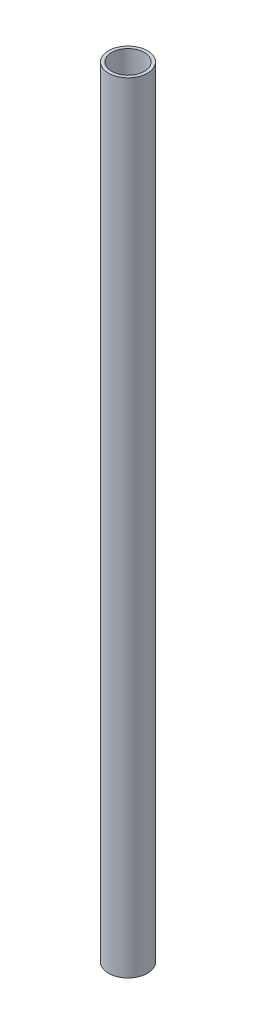
ISO-10303-21;
HEADER;
FILE_DESCRIPTION(('STEP AP214'),'2;1');
FILE_NAME('part.step','',(''),(''),'','','');
FILE_SCHEMA(('AUTOMOTIVE_DESIGN { 1 0 10303 214 1 1 1 1 }'));
ENDSEC;
DATA;
#1=APPLICATION_CONTEXT('core data for automotive mechanical design processes');
#2=APPLICATION_PROTOCOL_DEFINITION('international standard','automotive_design',2000,#1);
#3=PRODUCT_CONTEXT('',#1,'mechanical');
#4=PRODUCT('Part','Part','',(#3));
#5=PRODUCT_RELATED_PRODUCT_CATEGORY('part','',(#4));
#6=PRODUCT_DEFINITION_FORMATION('','',#4);
#7=PRODUCT_DEFINITION_CONTEXT('part definition',#1,'design');
#8=PRODUCT_DEFINITION('design','',#6,#7);
#9=PRODUCT_DEFINITION_SHAPE('','',#8);
#10=(LENGTH_UNIT() NAMED_UNIT(*) SI_UNIT(.MILLI.,.METRE.));
#11=(NAMED_UNIT(*) PLANE_ANGLE_UNIT() SI_UNIT($,.RADIAN.));
#12=(NAMED_UNIT(*) SI_UNIT($,.STERADIAN.) SOLID_ANGLE_UNIT());
#13=UNCERTAINTY_MEASURE_WITH_UNIT(LENGTH_MEASURE(1.E-05),#10,'distance_accuracy_value','');
#14=(GEOMETRIC_REPRESENTATION_CONTEXT(3) GLOBAL_UNCERTAINTY_ASSIGNED_CONTEXT((#13)) GLOBAL_UNIT_ASSIGNED_CONTEXT((#10,
#11,#12)) REPRESENTATION_CONTEXT('',''));
#15=CARTESIAN_POINT('',(0.,0.,0.));
#16=DIRECTION('',(0.,0.,1.));
#17=DIRECTION('',(1.,0.,0.));
#18=AXIS2_PLACEMENT_3D('',#15,#16,#17);
#19=CARTESIAN_POINT('',(0.,500.,0.));
#20=DIRECTION('',(0.,1.,0.));
#21=DIRECTION('',(0.,0.,1.));
#22=AXIS2_PLACEMENT_3D('',#19,#20,#21);
#23=PLANE('',#22);
#24=CARTESIAN_POINT('',(0.,500.,0.));
#25=DIRECTION('',(0.,1.,0.));
#26=DIRECTION('',(0.,0.,1.));
#27=AXIS2_PLACEMENT_3D('',#24,#25,#26);
#28=CIRCLE('',#27,12.5);
#29=CARTESIAN_POINT('',(0.,500.,12.5));
#30=VERTEX_POINT('',#29);
#31=EDGE_CURVE('E10',#30,#30,#28,.T.);
#32=ORIENTED_EDGE('',*,*,#31,.T.);
#33=EDGE_LOOP('',(#32));
#34=FACE_BOUND('',#33,.T.);
#35=CARTESIAN_POINT('',(0.,500.,0.));
#36=DIRECTION('',(0.,1.,0.));
#37=DIRECTION('',(0.,0.,1.));
#38=AXIS2_PLACEMENT_3D('',#35,#36,#37);
#39=CIRCLE('',#38,10.5);
#40=CARTESIAN_POINT('',(0.,500.,10.5));
#41=VERTEX_POINT('',#40);
#42=EDGE_CURVE('E42',#41,#41,#39,.T.);
#43=ORIENTED_EDGE('',*,*,#42,.F.);
#44=EDGE_LOOP('',(#43));
#45=FACE_BOUND('',#44,.T.);
#46=ADVANCED_FACE('F31',(#34,#45),#23,.T.);
#47=CARTESIAN_POINT('',(0.,0.,0.));
#48=DIRECTION('',(0.,1.,0.));
#49=DIRECTION('',(0.,0.,1.));
#50=AXIS2_PLACEMENT_3D('',#47,#48,#49);
#51=PLANE('',#50);
#52=CARTESIAN_POINT('',(0.,0.,0.));
#53=DIRECTION('',(0.,1.,0.));
#54=DIRECTION('',(0.,0.,1.));
#55=AXIS2_PLACEMENT_3D('',#52,#53,#54);
#56=CIRCLE('',#55,12.5);
#57=CARTESIAN_POINT('',(0.,0.,12.5));
#58=VERTEX_POINT('',#57);
#59=EDGE_CURVE('E35',#58,#58,#56,.T.);
#60=ORIENTED_EDGE('',*,*,#59,.F.);
#61=EDGE_LOOP('',(#60));
#62=FACE_BOUND('',#61,.T.);
#63=CARTESIAN_POINT('',(0.,0.,0.));
#64=DIRECTION('',(0.,1.,0.));
#65=DIRECTION('',(0.,0.,1.));
#66=AXIS2_PLACEMENT_3D('',#63,#64,#65);
#67=CIRCLE('',#66,10.5);
#68=CARTESIAN_POINT('',(0.,0.,10.5));
#69=VERTEX_POINT('',#68);
#70=EDGE_CURVE('E44',#69,#69,#67,.T.);
#71=ORIENTED_EDGE('',*,*,#70,.T.);
#72=EDGE_LOOP('',(#71));
#73=FACE_BOUND('',#72,.T.);
#74=ADVANCED_FACE('F54',(#62,#73),#51,.F.);
#75=CARTESIAN_POINT('',(0.,500.,0.));
#76=DIRECTION('',(0.,-1.,0.));
#77=DIRECTION('',(0.,0.,-1.));
#78=AXIS2_PLACEMENT_3D('',#75,#76,#77);
#79=CYLINDRICAL_SURFACE('',#78,12.5);
#80=ORIENTED_EDGE('',*,*,#31,.F.);
#81=EDGE_LOOP('',(#80));
#82=FACE_BOUND('',#81,.T.);
#83=ORIENTED_EDGE('',*,*,#59,.T.);
#84=EDGE_LOOP('',(#83));
#85=FACE_BOUND('',#84,.T.);
#86=ADVANCED_FACE('F33',(#82,#85),#79,.T.);
#87=CARTESIAN_POINT('',(0.,500.,0.));
#88=DIRECTION('',(0.,-1.,0.));
#89=DIRECTION('',(0.,0.,-1.));
#90=AXIS2_PLACEMENT_3D('',#87,#88,#89);
#91=CYLINDRICAL_SURFACE('',#90,10.5);
#92=ORIENTED_EDGE('',*,*,#42,.T.);
#93=EDGE_LOOP('',(#92));
#94=FACE_BOUND('',#93,.T.);
#95=ORIENTED_EDGE('',*,*,#70,.F.);
#96=EDGE_LOOP('',(#95));
#97=FACE_BOUND('',#96,.T.);
#98=ADVANCED_FACE('F50',(#94,#97),#91,.F.);
#99=CLOSED_SHELL('',(#46,#74,#86,#98));
#100=MANIFOLD_SOLID_BREP('B2',#99);
#101=ADVANCED_BREP_SHAPE_REPRESENTATION('',(#18,#100),#14);
#102=SHAPE_DEFINITION_REPRESENTATION(#9,#101);
ENDSEC;
END-ISO-10303-21;
